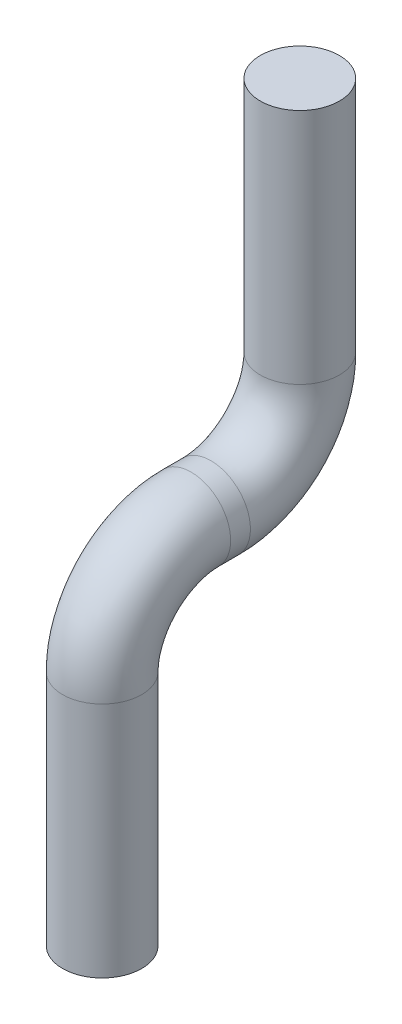
ISO-10303-21;
HEADER;
FILE_DESCRIPTION(('STEP AP214'),'2;1');
FILE_NAME('part.step','',(''),(''),'','','');
FILE_SCHEMA(('AUTOMOTIVE_DESIGN { 1 0 10303 214 1 1 1 1 }'));
ENDSEC;
DATA;
#1=APPLICATION_CONTEXT('core data for automotive mechanical design processes');
#2=APPLICATION_PROTOCOL_DEFINITION('international standard','automotive_design',2000,#1);
#3=PRODUCT_CONTEXT('',#1,'mechanical');
#4=PRODUCT('Part','Part','',(#3));
#5=PRODUCT_RELATED_PRODUCT_CATEGORY('part','',(#4));
#6=PRODUCT_DEFINITION_FORMATION('','',#4);
#7=PRODUCT_DEFINITION_CONTEXT('part definition',#1,'design');
#8=PRODUCT_DEFINITION('design','',#6,#7);
#9=PRODUCT_DEFINITION_SHAPE('','',#8);
#10=(LENGTH_UNIT() NAMED_UNIT(*) SI_UNIT(.MILLI.,.METRE.));
#11=(NAMED_UNIT(*) PLANE_ANGLE_UNIT() SI_UNIT($,.RADIAN.));
#12=(NAMED_UNIT(*) SI_UNIT($,.STERADIAN.) SOLID_ANGLE_UNIT());
#13=UNCERTAINTY_MEASURE_WITH_UNIT(LENGTH_MEASURE(1.E-05),#10,'distance_accuracy_value','');
#14=(GEOMETRIC_REPRESENTATION_CONTEXT(3) GLOBAL_UNCERTAINTY_ASSIGNED_CONTEXT((#13)) GLOBAL_UNIT_ASSIGNED_CONTEXT((#10,
#11,#12)) REPRESENTATION_CONTEXT('',''));
#15=CARTESIAN_POINT('',(0.,0.,0.));
#16=DIRECTION('',(0.,0.,1.));
#17=DIRECTION('',(1.,0.,0.));
#18=AXIS2_PLACEMENT_3D('',#15,#16,#17);
#19=CARTESIAN_POINT('',(0.,-4.65874455486536,20.));
#20=DIRECTION('',(0.,-1.,0.));
#21=DIRECTION('',(0.,0.,-1.));
#22=AXIS2_PLACEMENT_3D('',#19,#20,#21);
#23=PLANE('',#22);
#24=CARTESIAN_POINT('',(0.,-4.65874455486536,20.));
#25=DIRECTION('',(0.,-1.,0.));
#26=DIRECTION('',(0.,0.,-1.));
#27=AXIS2_PLACEMENT_3D('',#24,#25,#26);
#28=CIRCLE('',#27,4.);
#29=CARTESIAN_POINT('',(0.,-4.65874455486536,16.));
#30=VERTEX_POINT('',#29);
#31=EDGE_CURVE('E64',#30,#30,#28,.T.);
#32=ORIENTED_EDGE('',*,*,#31,.T.);
#33=EDGE_LOOP('',(#32));
#34=FACE_BOUND('',#33,.T.);
#35=ADVANCED_FACE('F37',(#34),#23,.T.);
#36=CARTESIAN_POINT('',(0.,61.3412554451346,0.));
#37=DIRECTION('',(0.,-1.,0.));
#38=DIRECTION('',(0.,0.,-1.));
#39=AXIS2_PLACEMENT_3D('',#36,#37,#38);
#40=PLANE('',#39);
#41=CARTESIAN_POINT('',(0.,61.3412554451346,0.));
#42=DIRECTION('',(0.,-1.,0.));
#43=DIRECTION('',(0.,0.,-1.));
#44=AXIS2_PLACEMENT_3D('',#41,#42,#43);
#45=CIRCLE('',#44,4.);
#46=CARTESIAN_POINT('',(0.,61.3412554451346,-4.));
#47=VERTEX_POINT('',#46);
#48=EDGE_CURVE('E10',#47,#47,#45,.T.);
#49=ORIENTED_EDGE('',*,*,#48,.F.);
#50=EDGE_LOOP('',(#49));
#51=FACE_BOUND('',#50,.T.);
#52=ADVANCED_FACE('F73',(#51),#40,.F.);
#53=CARTESIAN_POINT('',(0.,-4.65874455486536,20.));
#54=DIRECTION('',(0.,1.,0.));
#55=DIRECTION('',(0.,0.,1.));
#56=AXIS2_PLACEMENT_3D('',#53,#54,#55);
#57=CYLINDRICAL_SURFACE('',#56,4.);
#58=CARTESIAN_POINT('',(0.,19.3412554451346,20.));
#59=DIRECTION('',(0.,-1.,0.));
#60=DIRECTION('',(0.,0.,-1.));
#61=AXIS2_PLACEMENT_3D('',#58,#59,#60);
#62=CIRCLE('',#61,4.);
#63=CARTESIAN_POINT('',(0.,19.3412554451345,24.));
#64=VERTEX_POINT('',#63);
#65=EDGE_CURVE('E60',#64,#64,#62,.T.);
#66=ORIENTED_EDGE('',*,*,#65,.T.);
#67=EDGE_LOOP('',(#66));
#68=FACE_BOUND('',#67,.T.);
#69=ORIENTED_EDGE('',*,*,#31,.F.);
#70=EDGE_LOOP('',(#69));
#71=FACE_BOUND('',#70,.T.);
#72=ADVANCED_FACE('F70',(#68,#71),#57,.T.);
#73=CARTESIAN_POINT('',(0.,19.3412554451346,11.));
#74=DIRECTION('',(-1.,0.,0.));
#75=DIRECTION('',(0.,0.,1.));
#76=AXIS2_PLACEMENT_3D('',#73,#74,#75);
#77=TOROIDAL_SURFACE('',#76,9.00000000000003,4.);
#78=CARTESIAN_POINT('',(0.,28.3412554451346,10.9999999999999));
#79=DIRECTION('',(0.,0.,1.));
#80=DIRECTION('',(0.,-1.,0.));
#81=AXIS2_PLACEMENT_3D('',#78,#79,#80);
#82=CIRCLE('',#81,4.);
#83=CARTESIAN_POINT('',(0.,32.3412554451347,10.9999999999999));
#84=VERTEX_POINT('',#83);
#85=EDGE_CURVE('E54',#84,#84,#82,.T.);
#86=CARTESIAN_POINT('',(0.,19.3412554451346,11.));
#87=DIRECTION('',(-1.,0.,0.));
#88=DIRECTION('',(0.,0.,1.));
#89=AXIS2_PLACEMENT_3D('',#86,#87,#88);
#90=CIRCLE('',#89,13.);
#91=EDGE_CURVE('',#64,#84,#90,.T.);
#92=ORIENTED_EDGE('',*,*,#65,.F.);
#93=ORIENTED_EDGE('',*,*,#85,.T.);
#94=ORIENTED_EDGE('',*,*,#91,.T.);
#95=ORIENTED_EDGE('',*,*,#91,.F.);
#96=EDGE_LOOP('',(#92,#94,#93,#95));
#97=FACE_BOUND('',#96,.T.);
#98=ADVANCED_FACE('F72',(#97),#77,.T.);
#99=CARTESIAN_POINT('',(0.,28.3412554451346,10.9999999999999));
#100=DIRECTION('',(0.,0.,-1.));
#101=DIRECTION('',(-1.,0.,0.));
#102=AXIS2_PLACEMENT_3D('',#99,#100,#101);
#103=CYLINDRICAL_SURFACE('',#102,4.);
#104=CARTESIAN_POINT('',(0.,28.3412554451346,9.00000000000006));
#105=DIRECTION('',(0.,0.,1.));
#106=DIRECTION('',(0.,-1.,0.));
#107=AXIS2_PLACEMENT_3D('',#104,#105,#106);
#108=CIRCLE('',#107,4.);
#109=CARTESIAN_POINT('',(0.,24.3412554451346,9.00000000000009));
#110=VERTEX_POINT('',#109);
#111=EDGE_CURVE('E49',#110,#110,#108,.T.);
#112=ORIENTED_EDGE('',*,*,#111,.T.);
#113=EDGE_LOOP('',(#112));
#114=FACE_BOUND('',#113,.T.);
#115=ORIENTED_EDGE('',*,*,#85,.F.);
#116=EDGE_LOOP('',(#115));
#117=FACE_BOUND('',#116,.T.);
#118=ADVANCED_FACE('F80',(#114,#117),#103,.T.);
#119=CARTESIAN_POINT('',(0.,37.3412554451346,9.));
#120=DIRECTION('',(1.,0.,0.));
#121=DIRECTION('',(0.,0.,-1.));
#122=AXIS2_PLACEMENT_3D('',#119,#120,#121);
#123=TOROIDAL_SURFACE('',#122,9.,4.);
#124=CARTESIAN_POINT('',(0.,37.3412554451346,0.));
#125=DIRECTION('',(0.,-1.,0.));
#126=DIRECTION('',(0.,0.,-1.));
#127=AXIS2_PLACEMENT_3D('',#124,#125,#126);
#128=CIRCLE('',#127,4.);
#129=CARTESIAN_POINT('',(0.,37.3412554451346,-4.));
#130=VERTEX_POINT('',#129);
#131=EDGE_CURVE('E44',#130,#130,#128,.T.);
#132=CARTESIAN_POINT('',(0.,37.3412554451346,9.));
#133=DIRECTION('',(1.,0.,0.));
#134=DIRECTION('',(0.,0.,-1.));
#135=AXIS2_PLACEMENT_3D('',#132,#133,#134);
#136=CIRCLE('',#135,13.);
#137=EDGE_CURVE('',#110,#130,#136,.T.);
#138=ORIENTED_EDGE('',*,*,#111,.F.);
#139=ORIENTED_EDGE('',*,*,#131,.T.);
#140=ORIENTED_EDGE('',*,*,#137,.T.);
#141=ORIENTED_EDGE('',*,*,#137,.F.);
#142=EDGE_LOOP('',(#138,#140,#139,#141));
#143=FACE_BOUND('',#142,.T.);
#144=ADVANCED_FACE('F86',(#143),#123,.T.);
#145=CARTESIAN_POINT('',(0.,37.3412554451346,0.));
#146=DIRECTION('',(0.,1.,0.));
#147=DIRECTION('',(0.,0.,1.));
#148=AXIS2_PLACEMENT_3D('',#145,#146,#147);
#149=CYLINDRICAL_SURFACE('',#148,4.);
#150=ORIENTED_EDGE('',*,*,#48,.T.);
#151=EDGE_LOOP('',(#150));
#152=FACE_BOUND('',#151,.T.);
#153=ORIENTED_EDGE('',*,*,#131,.F.);
#154=EDGE_LOOP('',(#153));
#155=FACE_BOUND('',#154,.T.);
#156=ADVANCED_FACE('F84',(#152,#155),#149,.T.);
#157=CLOSED_SHELL('',(#35,#52,#72,#98,#118,#144,#156));
#158=MANIFOLD_SOLID_BREP('B2',#157);
#159=ADVANCED_BREP_SHAPE_REPRESENTATION('',(#18,#158),#14);
#160=SHAPE_DEFINITION_REPRESENTATION(#9,#159);
ENDSEC;
END-ISO-10303-21;
